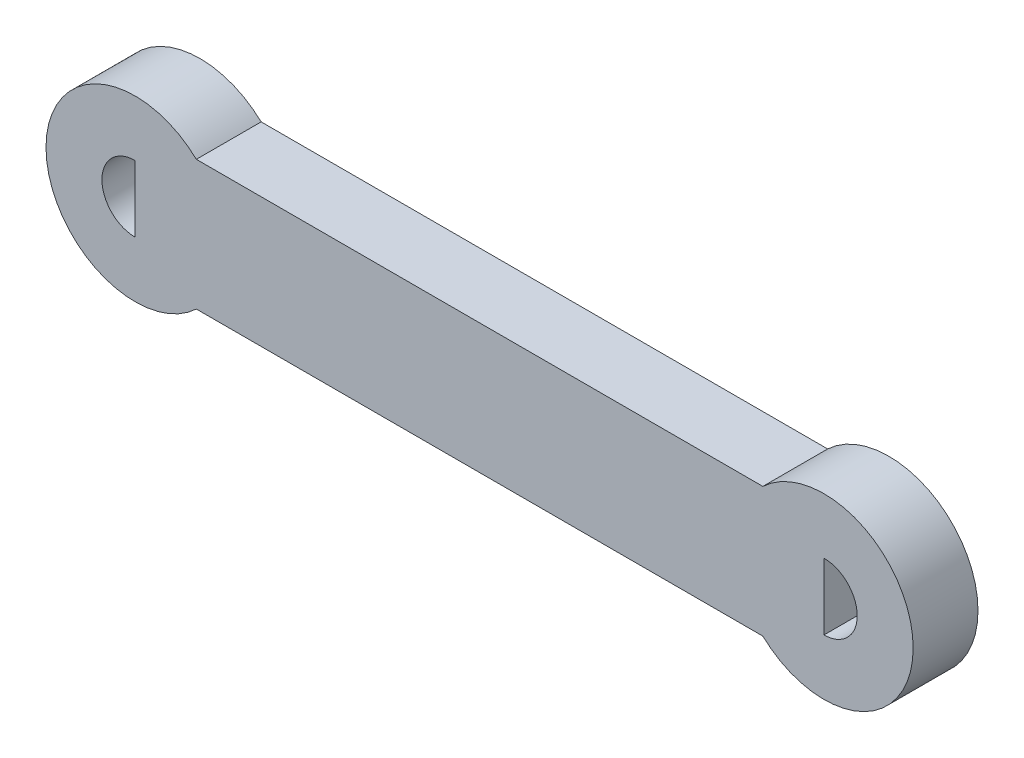
ISO-10303-21;
HEADER;
FILE_DESCRIPTION(('STEP AP214'),'2;1');
FILE_NAME('part.step','',(''),(''),'','','');
FILE_SCHEMA(('AUTOMOTIVE_DESIGN { 1 0 10303 214 1 1 1 1 }'));
ENDSEC;
DATA;
#1=APPLICATION_CONTEXT('core data for automotive mechanical design processes');
#2=APPLICATION_PROTOCOL_DEFINITION('international standard','automotive_design',2000,#1);
#3=PRODUCT_CONTEXT('',#1,'mechanical');
#4=PRODUCT('Part','Part','',(#3));
#5=PRODUCT_RELATED_PRODUCT_CATEGORY('part','',(#4));
#6=PRODUCT_DEFINITION_FORMATION('','',#4);
#7=PRODUCT_DEFINITION_CONTEXT('part definition',#1,'design');
#8=PRODUCT_DEFINITION('design','',#6,#7);
#9=PRODUCT_DEFINITION_SHAPE('','',#8);
#10=(LENGTH_UNIT() NAMED_UNIT(*) SI_UNIT(.MILLI.,.METRE.));
#11=(NAMED_UNIT(*) PLANE_ANGLE_UNIT() SI_UNIT($,.RADIAN.));
#12=(NAMED_UNIT(*) SI_UNIT($,.STERADIAN.) SOLID_ANGLE_UNIT());
#13=UNCERTAINTY_MEASURE_WITH_UNIT(LENGTH_MEASURE(1.E-05),#10,'distance_accuracy_value','');
#14=(GEOMETRIC_REPRESENTATION_CONTEXT(3) GLOBAL_UNCERTAINTY_ASSIGNED_CONTEXT((#13)) GLOBAL_UNIT_ASSIGNED_CONTEXT((#10,
#11,#12)) REPRESENTATION_CONTEXT('',''));
#15=CARTESIAN_POINT('',(0.,0.,0.));
#16=DIRECTION('',(0.,0.,1.));
#17=DIRECTION('',(1.,0.,0.));
#18=AXIS2_PLACEMENT_3D('',#15,#16,#17);
#19=CARTESIAN_POINT('',(0.,-8.,8.));
#20=DIRECTION('',(0.,1.,0.));
#21=DIRECTION('',(0.,0.,1.));
#22=AXIS2_PLACEMENT_3D('',#19,#20,#21);
#23=PLANE('',#22);
#24=DIRECTION('',(0.,0.,-1.));
#25=VECTOR('',#24,1.);
#26=CARTESIAN_POINT('',(77.4501655647293,-8.,8.));
#27=LINE('',#26,#25);
#28=CARTESIAN_POINT('',(77.4501655647293,-8.,8.));
#29=VERTEX_POINT('',#28);
#30=CARTESIAN_POINT('',(77.4501655647293,-8.,0.));
#31=VERTEX_POINT('',#30);
#32=EDGE_CURVE('E159',#29,#31,#27,.T.);
#33=ORIENTED_EDGE('',*,*,#32,.F.);
#34=DIRECTION('',(1.,0.,0.));
#35=VECTOR('',#34,1.);
#36=CARTESIAN_POINT('',(0.,-8.,8.));
#37=LINE('',#36,#35);
#38=CARTESIAN_POINT('',(7.54983443527075,-8.,8.));
#39=VERTEX_POINT('',#38);
#40=EDGE_CURVE('E119',#39,#29,#37,.T.);
#41=ORIENTED_EDGE('',*,*,#40,.F.);
#42=DIRECTION('',(0.,0.,-1.));
#43=VECTOR('',#42,1.);
#44=CARTESIAN_POINT('',(7.54983443527075,-8.,8.));
#45=LINE('',#44,#43);
#46=CARTESIAN_POINT('',(7.54983443527075,-8.,0.));
#47=VERTEX_POINT('',#46);
#48=EDGE_CURVE('E129',#47,#39,#45,.F.);
#49=ORIENTED_EDGE('',*,*,#48,.F.);
#50=DIRECTION('',(1.,0.,0.));
#51=VECTOR('',#50,1.);
#52=CARTESIAN_POINT('',(0.,-8.,0.));
#53=LINE('',#52,#51);
#54=EDGE_CURVE('E128',#47,#31,#53,.T.);
#55=ORIENTED_EDGE('',*,*,#54,.T.);
#56=EDGE_LOOP('',(#33,#41,#49,#55));
#57=FACE_BOUND('',#56,.T.);
#58=ADVANCED_FACE('F41',(#57),#23,.F.);
#59=CARTESIAN_POINT('',(85.,8.,8.));
#60=DIRECTION('',(0.,-1.,0.));
#61=DIRECTION('',(0.,0.,-1.));
#62=AXIS2_PLACEMENT_3D('',#59,#60,#61);
#63=PLANE('',#62);
#64=DIRECTION('',(0.,0.,-1.));
#65=VECTOR('',#64,1.);
#66=CARTESIAN_POINT('',(77.4501655647293,8.,8.));
#67=LINE('',#66,#65);
#68=CARTESIAN_POINT('',(77.4501655647293,8.,0.));
#69=VERTEX_POINT('',#68);
#70=CARTESIAN_POINT('',(77.4501655647293,8.,8.));
#71=VERTEX_POINT('',#70);
#72=EDGE_CURVE('E162',#69,#71,#67,.F.);
#73=ORIENTED_EDGE('',*,*,#72,.F.);
#74=DIRECTION('',(-1.,0.,0.));
#75=VECTOR('',#74,1.);
#76=CARTESIAN_POINT('',(85.,8.,0.));
#77=LINE('',#76,#75);
#78=CARTESIAN_POINT('',(7.54983443527075,8.,0.));
#79=VERTEX_POINT('',#78);
#80=EDGE_CURVE('E45',#69,#79,#77,.T.);
#81=ORIENTED_EDGE('',*,*,#80,.T.);
#82=DIRECTION('',(0.,0.,-1.));
#83=VECTOR('',#82,1.);
#84=CARTESIAN_POINT('',(7.54983443527075,8.,8.));
#85=LINE('',#84,#83);
#86=CARTESIAN_POINT('',(7.54983443527075,8.,8.));
#87=VERTEX_POINT('',#86);
#88=EDGE_CURVE('E143',#87,#79,#85,.T.);
#89=ORIENTED_EDGE('',*,*,#88,.F.);
#90=DIRECTION('',(-1.,0.,0.));
#91=VECTOR('',#90,1.);
#92=CARTESIAN_POINT('',(85.,8.,8.));
#93=LINE('',#92,#91);
#94=EDGE_CURVE('E11',#71,#87,#93,.T.);
#95=ORIENTED_EDGE('',*,*,#94,.F.);
#96=EDGE_LOOP('',(#73,#81,#89,#95));
#97=FACE_BOUND('',#96,.T.);
#98=ADVANCED_FACE('F183',(#97),#63,.F.);
#99=CARTESIAN_POINT('',(0.,8.,8.));
#100=DIRECTION('',(1.,0.,0.));
#101=DIRECTION('',(0.,0.,-1.));
#102=AXIS2_PLACEMENT_3D('',#99,#100,#101);
#103=PLANE('',#102);
#104=DIRECTION('',(0.,-1.,0.));
#105=VECTOR('',#104,1.);
#106=CARTESIAN_POINT('',(0.,8.,0.));
#107=LINE('',#106,#105);
#108=CARTESIAN_POINT('',(0.,4.1,0.));
#109=VERTEX_POINT('',#108);
#110=CARTESIAN_POINT('',(0.,-4.1,0.));
#111=VERTEX_POINT('',#110);
#112=EDGE_CURVE('E126',#109,#111,#107,.T.);
#113=ORIENTED_EDGE('',*,*,#112,.T.);
#114=DIRECTION('',(0.,0.,-1.));
#115=VECTOR('',#114,1.);
#116=CARTESIAN_POINT('',(0.,-4.1,8.));
#117=LINE('',#116,#115);
#118=CARTESIAN_POINT('',(0.,-4.1,8.));
#119=VERTEX_POINT('',#118);
#120=EDGE_CURVE('E145',#111,#119,#117,.F.);
#121=ORIENTED_EDGE('',*,*,#120,.T.);
#122=DIRECTION('',(0.,-1.,0.));
#123=VECTOR('',#122,1.);
#124=CARTESIAN_POINT('',(0.,8.,8.));
#125=LINE('',#124,#123);
#126=CARTESIAN_POINT('',(0.,4.1,8.));
#127=VERTEX_POINT('',#126);
#128=EDGE_CURVE('E122',#127,#119,#125,.T.);
#129=ORIENTED_EDGE('',*,*,#128,.F.);
#130=DIRECTION('',(0.,0.,-1.));
#131=VECTOR('',#130,1.);
#132=CARTESIAN_POINT('',(0.,4.1,8.));
#133=LINE('',#132,#131);
#134=EDGE_CURVE('E147',#127,#109,#133,.T.);
#135=ORIENTED_EDGE('',*,*,#134,.T.);
#136=EDGE_LOOP('',(#113,#121,#129,#135));
#137=FACE_BOUND('',#136,.T.);
#138=ADVANCED_FACE('F43',(#137),#103,.F.);
#139=CARTESIAN_POINT('',(85.,-8.,8.));
#140=DIRECTION('',(-1.,0.,0.));
#141=DIRECTION('',(0.,0.,1.));
#142=AXIS2_PLACEMENT_3D('',#139,#140,#141);
#143=PLANE('',#142);
#144=DIRECTION('',(0.,1.,0.));
#145=VECTOR('',#144,1.);
#146=CARTESIAN_POINT('',(85.,-8.,0.));
#147=LINE('',#146,#145);
#148=CARTESIAN_POINT('',(85.,-4.1,0.));
#149=VERTEX_POINT('',#148);
#150=CARTESIAN_POINT('',(85.,4.1,0.));
#151=VERTEX_POINT('',#150);
#152=EDGE_CURVE('E131',#149,#151,#147,.T.);
#153=ORIENTED_EDGE('',*,*,#152,.T.);
#154=DIRECTION('',(0.,0.,-1.));
#155=VECTOR('',#154,1.);
#156=CARTESIAN_POINT('',(85.,4.1,8.));
#157=LINE('',#156,#155);
#158=CARTESIAN_POINT('',(85.,4.1,8.));
#159=VERTEX_POINT('',#158);
#160=EDGE_CURVE('E109',#151,#159,#157,.F.);
#161=ORIENTED_EDGE('',*,*,#160,.T.);
#162=DIRECTION('',(0.,1.,0.));
#163=VECTOR('',#162,1.);
#164=CARTESIAN_POINT('',(85.,-8.,8.));
#165=LINE('',#164,#163);
#166=CARTESIAN_POINT('',(85.,-4.1,8.));
#167=VERTEX_POINT('',#166);
#168=EDGE_CURVE('E50',#167,#159,#165,.T.);
#169=ORIENTED_EDGE('',*,*,#168,.F.);
#170=DIRECTION('',(0.,0.,-1.));
#171=VECTOR('',#170,1.);
#172=CARTESIAN_POINT('',(85.,-4.1,8.));
#173=LINE('',#172,#171);
#174=EDGE_CURVE('E103',#167,#149,#173,.T.);
#175=ORIENTED_EDGE('',*,*,#174,.T.);
#176=EDGE_LOOP('',(#153,#161,#169,#175));
#177=FACE_BOUND('',#176,.T.);
#178=ADVANCED_FACE('F118',(#177),#143,.F.);
#179=CARTESIAN_POINT('',(0.,0.,8.));
#180=DIRECTION('',(0.,0.,1.));
#181=DIRECTION('',(1.,0.,0.));
#182=AXIS2_PLACEMENT_3D('',#179,#180,#181);
#183=PLANE('',#182);
#184=CARTESIAN_POINT('',(85.,0.,8.));
#185=DIRECTION('',(0.,0.,1.));
#186=DIRECTION('',(1.,0.,0.));
#187=AXIS2_PLACEMENT_3D('',#184,#185,#186);
#188=CIRCLE('',#187,11.);
#189=EDGE_CURVE('E110',#29,#71,#188,.T.);
#190=ORIENTED_EDGE('',*,*,#189,.T.);
#191=ORIENTED_EDGE('',*,*,#94,.T.);
#192=CARTESIAN_POINT('',(0.,0.,8.));
#193=DIRECTION('',(0.,0.,1.));
#194=DIRECTION('',(1.,0.,0.));
#195=AXIS2_PLACEMENT_3D('',#192,#193,#194);
#196=CIRCLE('',#195,11.);
#197=EDGE_CURVE('E149',#87,#39,#196,.T.);
#198=ORIENTED_EDGE('',*,*,#197,.T.);
#199=ORIENTED_EDGE('',*,*,#40,.T.);
#200=EDGE_LOOP('',(#190,#191,#198,#199));
#201=FACE_BOUND('',#200,.T.);
#202=CARTESIAN_POINT('',(85.,0.,8.));
#203=DIRECTION('',(0.,0.,1.));
#204=DIRECTION('',(1.,0.,0.));
#205=AXIS2_PLACEMENT_3D('',#202,#203,#204);
#206=CIRCLE('',#205,4.1);
#207=EDGE_CURVE('E58',#167,#159,#206,.T.);
#208=ORIENTED_EDGE('',*,*,#207,.F.);
#209=ORIENTED_EDGE('',*,*,#168,.T.);
#210=EDGE_LOOP('',(#208,#209));
#211=FACE_BOUND('',#210,.T.);
#212=CARTESIAN_POINT('',(0.,0.,8.));
#213=DIRECTION('',(0.,0.,1.));
#214=DIRECTION('',(1.,0.,0.));
#215=AXIS2_PLACEMENT_3D('',#212,#213,#214);
#216=CIRCLE('',#215,4.1);
#217=EDGE_CURVE('E153',#127,#119,#216,.T.);
#218=ORIENTED_EDGE('',*,*,#217,.F.);
#219=ORIENTED_EDGE('',*,*,#128,.T.);
#220=EDGE_LOOP('',(#218,#219));
#221=FACE_BOUND('',#220,.T.);
#222=ADVANCED_FACE('F114',(#201,#211,#221),#183,.T.);
#223=CARTESIAN_POINT('',(0.,0.,0.));
#224=DIRECTION('',(0.,0.,1.));
#225=DIRECTION('',(1.,0.,0.));
#226=AXIS2_PLACEMENT_3D('',#223,#224,#225);
#227=PLANE('',#226);
#228=ORIENTED_EDGE('',*,*,#80,.F.);
#229=CARTESIAN_POINT('',(85.,0.,0.));
#230=DIRECTION('',(0.,0.,1.));
#231=DIRECTION('',(1.,0.,0.));
#232=AXIS2_PLACEMENT_3D('',#229,#230,#231);
#233=CIRCLE('',#232,11.);
#234=EDGE_CURVE('E116',#31,#69,#233,.T.);
#235=ORIENTED_EDGE('',*,*,#234,.F.);
#236=ORIENTED_EDGE('',*,*,#54,.F.);
#237=CARTESIAN_POINT('',(0.,0.,0.));
#238=DIRECTION('',(0.,0.,1.));
#239=DIRECTION('',(1.,0.,0.));
#240=AXIS2_PLACEMENT_3D('',#237,#238,#239);
#241=CIRCLE('',#240,11.);
#242=EDGE_CURVE('E150',#79,#47,#241,.T.);
#243=ORIENTED_EDGE('',*,*,#242,.F.);
#244=EDGE_LOOP('',(#228,#235,#236,#243));
#245=FACE_BOUND('',#244,.T.);
#246=ORIENTED_EDGE('',*,*,#152,.F.);
#247=CARTESIAN_POINT('',(85.,0.,0.));
#248=DIRECTION('',(0.,0.,1.));
#249=DIRECTION('',(1.,0.,0.));
#250=AXIS2_PLACEMENT_3D('',#247,#248,#249);
#251=CIRCLE('',#250,4.1);
#252=EDGE_CURVE('E63',#149,#151,#251,.T.);
#253=ORIENTED_EDGE('',*,*,#252,.T.);
#254=EDGE_LOOP('',(#246,#253));
#255=FACE_BOUND('',#254,.T.);
#256=ORIENTED_EDGE('',*,*,#112,.F.);
#257=CARTESIAN_POINT('',(0.,0.,0.));
#258=DIRECTION('',(0.,0.,1.));
#259=DIRECTION('',(1.,0.,0.));
#260=AXIS2_PLACEMENT_3D('',#257,#258,#259);
#261=CIRCLE('',#260,4.1);
#262=EDGE_CURVE('E156',#109,#111,#261,.T.);
#263=ORIENTED_EDGE('',*,*,#262,.T.);
#264=EDGE_LOOP('',(#256,#263));
#265=FACE_BOUND('',#264,.T.);
#266=ADVANCED_FACE('F169',(#245,#255,#265),#227,.F.);
#267=CARTESIAN_POINT('',(0.,0.,8.));
#268=DIRECTION('',(0.,0.,-1.));
#269=DIRECTION('',(-1.,0.,0.));
#270=AXIS2_PLACEMENT_3D('',#267,#268,#269);
#271=CYLINDRICAL_SURFACE('',#270,11.);
#272=ORIENTED_EDGE('',*,*,#242,.T.);
#273=ORIENTED_EDGE('',*,*,#48,.T.);
#274=ORIENTED_EDGE('',*,*,#197,.F.);
#275=ORIENTED_EDGE('',*,*,#88,.T.);
#276=EDGE_LOOP('',(#272,#273,#274,#275));
#277=FACE_BOUND('',#276,.T.);
#278=ADVANCED_FACE('F172',(#277),#271,.T.);
#279=CARTESIAN_POINT('',(0.,0.,8.));
#280=DIRECTION('',(0.,0.,-1.));
#281=DIRECTION('',(-1.,0.,0.));
#282=AXIS2_PLACEMENT_3D('',#279,#280,#281);
#283=CYLINDRICAL_SURFACE('',#282,4.1);
#284=ORIENTED_EDGE('',*,*,#120,.F.);
#285=ORIENTED_EDGE('',*,*,#262,.F.);
#286=ORIENTED_EDGE('',*,*,#134,.F.);
#287=ORIENTED_EDGE('',*,*,#217,.T.);
#288=EDGE_LOOP('',(#284,#285,#286,#287));
#289=FACE_BOUND('',#288,.T.);
#290=ADVANCED_FACE('F181',(#289),#283,.F.);
#291=CARTESIAN_POINT('',(85.,0.,8.));
#292=DIRECTION('',(0.,0.,-1.));
#293=DIRECTION('',(-1.,0.,0.));
#294=AXIS2_PLACEMENT_3D('',#291,#292,#293);
#295=CYLINDRICAL_SURFACE('',#294,11.);
#296=ORIENTED_EDGE('',*,*,#189,.F.);
#297=ORIENTED_EDGE('',*,*,#32,.T.);
#298=ORIENTED_EDGE('',*,*,#234,.T.);
#299=ORIENTED_EDGE('',*,*,#72,.T.);
#300=EDGE_LOOP('',(#296,#297,#298,#299));
#301=FACE_BOUND('',#300,.T.);
#302=ADVANCED_FACE('F204',(#301),#295,.T.);
#303=CARTESIAN_POINT('',(85.,0.,8.));
#304=DIRECTION('',(0.,0.,-1.));
#305=DIRECTION('',(-1.,0.,0.));
#306=AXIS2_PLACEMENT_3D('',#303,#304,#305);
#307=CYLINDRICAL_SURFACE('',#306,4.1);
#308=ORIENTED_EDGE('',*,*,#160,.F.);
#309=ORIENTED_EDGE('',*,*,#252,.F.);
#310=ORIENTED_EDGE('',*,*,#174,.F.);
#311=ORIENTED_EDGE('',*,*,#207,.T.);
#312=EDGE_LOOP('',(#308,#309,#310,#311));
#313=FACE_BOUND('',#312,.T.);
#314=ADVANCED_FACE('F104',(#313),#307,.F.);
#315=CLOSED_SHELL('',(#58,#98,#138,#178,#222,#266,#278,#290,#302,#314));
#316=MANIFOLD_SOLID_BREP('B2',#315);
#317=ADVANCED_BREP_SHAPE_REPRESENTATION('',(#18,#316),#14);
#318=SHAPE_DEFINITION_REPRESENTATION(#9,#317);
ENDSEC;
END-ISO-10303-21;
